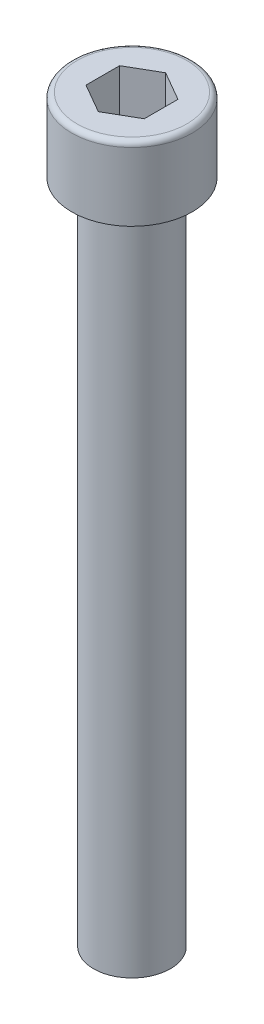
ISO-10303-21;
HEADER;
FILE_DESCRIPTION(('STEP AP214'),'2;1');
FILE_NAME('part.step','',(''),(''),'','','');
FILE_SCHEMA(('AUTOMOTIVE_DESIGN { 1 0 10303 214 1 1 1 1 }'));
ENDSEC;
DATA;
#1=APPLICATION_CONTEXT('core data for automotive mechanical design processes');
#2=APPLICATION_PROTOCOL_DEFINITION('international standard','automotive_design',2000,#1);
#3=PRODUCT_CONTEXT('',#1,'mechanical');
#4=PRODUCT('Part','Part','',(#3));
#5=PRODUCT_RELATED_PRODUCT_CATEGORY('part','',(#4));
#6=PRODUCT_DEFINITION_FORMATION('','',#4);
#7=PRODUCT_DEFINITION_CONTEXT('part definition',#1,'design');
#8=PRODUCT_DEFINITION('design','',#6,#7);
#9=PRODUCT_DEFINITION_SHAPE('','',#8);
#10=(LENGTH_UNIT() NAMED_UNIT(*) SI_UNIT(.MILLI.,.METRE.));
#11=(NAMED_UNIT(*) PLANE_ANGLE_UNIT() SI_UNIT($,.RADIAN.));
#12=(NAMED_UNIT(*) SI_UNIT($,.STERADIAN.) SOLID_ANGLE_UNIT());
#13=UNCERTAINTY_MEASURE_WITH_UNIT(LENGTH_MEASURE(1.E-05),#10,'distance_accuracy_value','');
#14=(GEOMETRIC_REPRESENTATION_CONTEXT(3) GLOBAL_UNCERTAINTY_ASSIGNED_CONTEXT((#13)) GLOBAL_UNIT_ASSIGNED_CONTEXT((#10,
#11,#12)) REPRESENTATION_CONTEXT('',''));
#15=CARTESIAN_POINT('',(0.,0.,0.));
#16=DIRECTION('',(0.,0.,1.));
#17=DIRECTION('',(1.,0.,0.));
#18=AXIS2_PLACEMENT_3D('',#15,#16,#17);
#19=CARTESIAN_POINT('',(0.,-31.75,0.));
#20=DIRECTION('',(0.,1.,0.));
#21=DIRECTION('',(0.,0.,1.));
#22=AXIS2_PLACEMENT_3D('',#19,#20,#21);
#23=CYLINDRICAL_SURFACE('',#22,1.8288);
#24=CARTESIAN_POINT('',(0.,-31.75,0.));
#25=DIRECTION('',(0.,1.,0.));
#26=DIRECTION('',(0.,0.,1.));
#27=AXIS2_PLACEMENT_3D('',#24,#25,#26);
#28=CIRCLE('',#27,1.8288);
#29=CARTESIAN_POINT('',(0.,-31.75,1.8288));
#30=VERTEX_POINT('',#29);
#31=EDGE_CURVE('E144',#30,#30,#28,.T.);
#32=ORIENTED_EDGE('',*,*,#31,.T.);
#33=EDGE_LOOP('',(#32));
#34=FACE_BOUND('',#33,.T.);
#35=CARTESIAN_POINT('',(0.,0.,0.));
#36=DIRECTION('',(0.,1.,0.));
#37=DIRECTION('',(0.,0.,1.));
#38=AXIS2_PLACEMENT_3D('',#35,#36,#37);
#39=CIRCLE('',#38,1.8288);
#40=CARTESIAN_POINT('',(0.,0.,1.8288));
#41=VERTEX_POINT('',#40);
#42=EDGE_CURVE('E143',#41,#41,#39,.T.);
#43=ORIENTED_EDGE('',*,*,#42,.F.);
#44=EDGE_LOOP('',(#43));
#45=FACE_BOUND('',#44,.T.);
#46=ADVANCED_FACE('F33',(#34,#45),#23,.T.);
#47=CARTESIAN_POINT('',(0.,-31.75,0.));
#48=DIRECTION('',(0.,1.,0.));
#49=DIRECTION('',(0.,0.,1.));
#50=AXIS2_PLACEMENT_3D('',#47,#48,#49);
#51=PLANE('',#50);
#52=ORIENTED_EDGE('',*,*,#31,.F.);
#53=EDGE_LOOP('',(#52));
#54=FACE_BOUND('',#53,.T.);
#55=ADVANCED_FACE('F167',(#54),#51,.F.);
#56=CARTESIAN_POINT('',(0.,3.5052,0.));
#57=DIRECTION('',(0.,-1.,0.));
#58=DIRECTION('',(0.,0.,-1.));
#59=AXIS2_PLACEMENT_3D('',#56,#57,#58);
#60=CYLINDRICAL_SURFACE('',#59,2.8702);
#61=CARTESIAN_POINT('',(0.,3.2512,0.));
#62=DIRECTION('',(0.,1.,0.));
#63=DIRECTION('',(0.,0.,1.));
#64=AXIS2_PLACEMENT_3D('',#61,#62,#63);
#65=CIRCLE('',#64,2.8702);
#66=CARTESIAN_POINT('',(0.,3.2512,2.8702));
#67=VERTEX_POINT('',#66);
#68=EDGE_CURVE('E11',#67,#67,#65,.F.);
#69=ORIENTED_EDGE('',*,*,#68,.T.);
#70=EDGE_LOOP('',(#69));
#71=FACE_BOUND('',#70,.T.);
#72=CARTESIAN_POINT('',(0.,0.,0.));
#73=DIRECTION('',(0.,1.,0.));
#74=DIRECTION('',(0.,0.,1.));
#75=AXIS2_PLACEMENT_3D('',#72,#73,#74);
#76=CIRCLE('',#75,2.8702);
#77=CARTESIAN_POINT('',(0.,0.,2.8702));
#78=VERTEX_POINT('',#77);
#79=EDGE_CURVE('E135',#78,#78,#76,.T.);
#80=ORIENTED_EDGE('',*,*,#79,.T.);
#81=EDGE_LOOP('',(#80));
#82=FACE_BOUND('',#81,.T.);
#83=ADVANCED_FACE('F172',(#71,#82),#60,.T.);
#84=CARTESIAN_POINT('',(0.,3.5052,0.));
#85=DIRECTION('',(0.,1.,0.));
#86=DIRECTION('',(0.,0.,1.));
#87=AXIS2_PLACEMENT_3D('',#84,#85,#86);
#88=PLANE('',#87);
#89=DIRECTION('',(-0.866025403784439,0.,-0.5));
#90=VECTOR('',#89,1.);
#91=CARTESIAN_POINT('',(1.3890625,3.5052,-0.801975608296215));
#92=LINE('',#91,#90);
#93=CARTESIAN_POINT('',(1.3890625,3.5052,-0.801975608296215));
#94=VERTEX_POINT('',#93);
#95=CARTESIAN_POINT('',(0.,3.5052,-1.60395121659243));
#96=VERTEX_POINT('',#95);
#97=EDGE_CURVE('E48',#94,#96,#92,.T.);
#98=ORIENTED_EDGE('',*,*,#97,.F.);
#99=DIRECTION('',(0.,0.,-1.));
#100=VECTOR('',#99,1.);
#101=CARTESIAN_POINT('',(1.3890625,3.5052,0.801975608296215));
#102=LINE('',#101,#100);
#103=CARTESIAN_POINT('',(1.3890625,3.5052,0.801975608296215));
#104=VERTEX_POINT('',#103);
#105=EDGE_CURVE('E131',#104,#94,#102,.T.);
#106=ORIENTED_EDGE('',*,*,#105,.F.);
#107=DIRECTION('',(0.866025403784439,0.,-0.5));
#108=VECTOR('',#107,1.);
#109=CARTESIAN_POINT('',(0.,3.5052,1.60395121659243));
#110=LINE('',#109,#108);
#111=CARTESIAN_POINT('',(0.,3.5052,1.60395121659243));
#112=VERTEX_POINT('',#111);
#113=EDGE_CURVE('E129',#112,#104,#110,.T.);
#114=ORIENTED_EDGE('',*,*,#113,.F.);
#115=DIRECTION('',(0.866025403784439,0.,0.5));
#116=VECTOR('',#115,1.);
#117=CARTESIAN_POINT('',(-1.3890625,3.5052,0.801975608296215));
#118=LINE('',#117,#116);
#119=CARTESIAN_POINT('',(-1.3890625,3.5052,0.801975608296215));
#120=VERTEX_POINT('',#119);
#121=EDGE_CURVE('E96',#120,#112,#118,.T.);
#122=ORIENTED_EDGE('',*,*,#121,.F.);
#123=DIRECTION('',(0.,0.,1.));
#124=VECTOR('',#123,1.);
#125=CARTESIAN_POINT('',(-1.3890625,3.5052,-0.801975608296215));
#126=LINE('',#125,#124);
#127=CARTESIAN_POINT('',(-1.3890625,3.5052,-0.801975608296215));
#128=VERTEX_POINT('',#127);
#129=EDGE_CURVE('E125',#128,#120,#126,.T.);
#130=ORIENTED_EDGE('',*,*,#129,.F.);
#131=DIRECTION('',(-0.866025403784439,0.,0.5));
#132=VECTOR('',#131,1.);
#133=CARTESIAN_POINT('',(0.,3.5052,-1.60395121659243));
#134=LINE('',#133,#132);
#135=EDGE_CURVE('E122',#96,#128,#134,.T.);
#136=ORIENTED_EDGE('',*,*,#135,.F.);
#137=EDGE_LOOP('',(#98,#106,#114,#122,#130,#136));
#138=FACE_BOUND('',#137,.T.);
#139=CARTESIAN_POINT('',(0.,3.5052,0.));
#140=DIRECTION('',(0.,1.,0.));
#141=DIRECTION('',(0.,0.,1.));
#142=AXIS2_PLACEMENT_3D('',#139,#140,#141);
#143=CIRCLE('',#142,2.6162);
#144=CARTESIAN_POINT('',(0.,3.5052,2.6162));
#145=VERTEX_POINT('',#144);
#146=EDGE_CURVE('E41',#145,#145,#143,.T.);
#147=ORIENTED_EDGE('',*,*,#146,.T.);
#148=EDGE_LOOP('',(#147));
#149=FACE_BOUND('',#148,.T.);
#150=ADVANCED_FACE('F151',(#138,#149),#88,.T.);
#151=CARTESIAN_POINT('',(0.,0.,0.));
#152=DIRECTION('',(0.,1.,0.));
#153=DIRECTION('',(0.,0.,1.));
#154=AXIS2_PLACEMENT_3D('',#151,#152,#153);
#155=PLANE('',#154);
#156=ORIENTED_EDGE('',*,*,#42,.T.);
#157=EDGE_LOOP('',(#156));
#158=FACE_BOUND('',#157,.T.);
#159=ORIENTED_EDGE('',*,*,#79,.F.);
#160=EDGE_LOOP('',(#159));
#161=FACE_BOUND('',#160,.T.);
#162=ADVANCED_FACE('F155',(#158,#161),#155,.F.);
#163=CARTESIAN_POINT('',(0.,3.2512,0.));
#164=DIRECTION('',(0.,1.,0.));
#165=DIRECTION('',(0.,0.,1.));
#166=AXIS2_PLACEMENT_3D('',#163,#164,#165);
#167=TOROIDAL_SURFACE('',#166,2.6162,0.254);
#168=ORIENTED_EDGE('',*,*,#68,.F.);
#169=EDGE_LOOP('',(#168));
#170=FACE_BOUND('',#169,.T.);
#171=ORIENTED_EDGE('',*,*,#146,.F.);
#172=EDGE_LOOP('',(#171));
#173=FACE_BOUND('',#172,.T.);
#174=ADVANCED_FACE('F35',(#170,#173),#167,.T.);
#175=CARTESIAN_POINT('',(1.3890625,0.9652,-0.801975608296215));
#176=DIRECTION('',(0.5,0.,-0.866025403784439));
#177=DIRECTION('',(-0.866025403784439,0.,-0.5));
#178=AXIS2_PLACEMENT_3D('',#175,#176,#177);
#179=PLANE('',#178);
#180=ORIENTED_EDGE('',*,*,#97,.T.);
#181=DIRECTION('',(0.,1.,0.));
#182=VECTOR('',#181,1.);
#183=CARTESIAN_POINT('',(0.,0.9652,-1.60395121659243));
#184=LINE('',#183,#182);
#185=CARTESIAN_POINT('',(0.,0.9652,-1.60395121659243));
#186=VERTEX_POINT('',#185);
#187=EDGE_CURVE('E78',#186,#96,#184,.T.);
#188=ORIENTED_EDGE('',*,*,#187,.F.);
#189=DIRECTION('',(-0.866025403784439,0.,-0.5));
#190=VECTOR('',#189,1.);
#191=CARTESIAN_POINT('',(1.3890625,0.9652,-0.801975608296215));
#192=LINE('',#191,#190);
#193=CARTESIAN_POINT('',(1.3890625,0.9652,-0.801975608296215));
#194=VERTEX_POINT('',#193);
#195=EDGE_CURVE('E133',#194,#186,#192,.T.);
#196=ORIENTED_EDGE('',*,*,#195,.F.);
#197=DIRECTION('',(0.,1.,0.));
#198=VECTOR('',#197,1.);
#199=CARTESIAN_POINT('',(1.3890625,0.9652,-0.801975608296215));
#200=LINE('',#199,#198);
#201=EDGE_CURVE('E56',#194,#94,#200,.T.);
#202=ORIENTED_EDGE('',*,*,#201,.T.);
#203=EDGE_LOOP('',(#180,#188,#196,#202));
#204=FACE_BOUND('',#203,.T.);
#205=ADVANCED_FACE('F154',(#204),#179,.F.);
#206=CARTESIAN_POINT('',(1.3890625,0.9652,0.801975608296215));
#207=DIRECTION('',(1.,0.,0.));
#208=DIRECTION('',(0.,0.,-1.));
#209=AXIS2_PLACEMENT_3D('',#206,#207,#208);
#210=PLANE('',#209);
#211=ORIENTED_EDGE('',*,*,#105,.T.);
#212=ORIENTED_EDGE('',*,*,#201,.F.);
#213=DIRECTION('',(0.,0.,-1.));
#214=VECTOR('',#213,1.);
#215=CARTESIAN_POINT('',(1.3890625,0.9652,0.801975608296215));
#216=LINE('',#215,#214);
#217=CARTESIAN_POINT('',(1.3890625,0.9652,0.801975608296215));
#218=VERTEX_POINT('',#217);
#219=EDGE_CURVE('E108',#218,#194,#216,.T.);
#220=ORIENTED_EDGE('',*,*,#219,.F.);
#221=DIRECTION('',(0.,1.,0.));
#222=VECTOR('',#221,1.);
#223=CARTESIAN_POINT('',(1.3890625,0.9652,0.801975608296215));
#224=LINE('',#223,#222);
#225=EDGE_CURVE('E100',#218,#104,#224,.T.);
#226=ORIENTED_EDGE('',*,*,#225,.T.);
#227=EDGE_LOOP('',(#211,#212,#220,#226));
#228=FACE_BOUND('',#227,.T.);
#229=ADVANCED_FACE('F161',(#228),#210,.F.);
#230=CARTESIAN_POINT('',(0.,0.9652,1.60395121659243));
#231=DIRECTION('',(0.5,0.,0.866025403784439));
#232=DIRECTION('',(0.866025403784439,0.,-0.5));
#233=AXIS2_PLACEMENT_3D('',#230,#231,#232);
#234=PLANE('',#233);
#235=ORIENTED_EDGE('',*,*,#113,.T.);
#236=ORIENTED_EDGE('',*,*,#225,.F.);
#237=DIRECTION('',(0.866025403784439,0.,-0.5));
#238=VECTOR('',#237,1.);
#239=CARTESIAN_POINT('',(0.,0.9652,1.60395121659243));
#240=LINE('',#239,#238);
#241=CARTESIAN_POINT('',(0.,0.9652,1.60395121659243));
#242=VERTEX_POINT('',#241);
#243=EDGE_CURVE('E104',#242,#218,#240,.T.);
#244=ORIENTED_EDGE('',*,*,#243,.F.);
#245=DIRECTION('',(0.,1.,0.));
#246=VECTOR('',#245,1.);
#247=CARTESIAN_POINT('',(0.,0.9652,1.60395121659243));
#248=LINE('',#247,#246);
#249=EDGE_CURVE('E89',#242,#112,#248,.T.);
#250=ORIENTED_EDGE('',*,*,#249,.T.);
#251=EDGE_LOOP('',(#235,#236,#244,#250));
#252=FACE_BOUND('',#251,.T.);
#253=ADVANCED_FACE('F105',(#252),#234,.F.);
#254=CARTESIAN_POINT('',(-1.3890625,0.9652,0.801975608296215));
#255=DIRECTION('',(-0.5,0.,0.866025403784439));
#256=DIRECTION('',(0.866025403784439,0.,0.5));
#257=AXIS2_PLACEMENT_3D('',#254,#255,#256);
#258=PLANE('',#257);
#259=ORIENTED_EDGE('',*,*,#121,.T.);
#260=ORIENTED_EDGE('',*,*,#249,.F.);
#261=DIRECTION('',(0.866025403784439,0.,0.5));
#262=VECTOR('',#261,1.);
#263=CARTESIAN_POINT('',(-1.3890625,0.9652,0.801975608296215));
#264=LINE('',#263,#262);
#265=CARTESIAN_POINT('',(-1.3890625,0.9652,0.801975608296215));
#266=VERTEX_POINT('',#265);
#267=EDGE_CURVE('E93',#266,#242,#264,.T.);
#268=ORIENTED_EDGE('',*,*,#267,.F.);
#269=DIRECTION('',(0.,1.,0.));
#270=VECTOR('',#269,1.);
#271=CARTESIAN_POINT('',(-1.3890625,0.9652,0.801975608296215));
#272=LINE('',#271,#270);
#273=EDGE_CURVE('E101',#266,#120,#272,.T.);
#274=ORIENTED_EDGE('',*,*,#273,.T.);
#275=EDGE_LOOP('',(#259,#260,#268,#274));
#276=FACE_BOUND('',#275,.T.);
#277=ADVANCED_FACE('F91',(#276),#258,.F.);
#278=CARTESIAN_POINT('',(-1.3890625,0.9652,-0.801975608296215));
#279=DIRECTION('',(-1.,0.,0.));
#280=DIRECTION('',(0.,0.,1.));
#281=AXIS2_PLACEMENT_3D('',#278,#279,#280);
#282=PLANE('',#281);
#283=ORIENTED_EDGE('',*,*,#129,.T.);
#284=ORIENTED_EDGE('',*,*,#273,.F.);
#285=DIRECTION('',(0.,0.,1.));
#286=VECTOR('',#285,1.);
#287=CARTESIAN_POINT('',(-1.3890625,0.9652,-0.801975608296215));
#288=LINE('',#287,#286);
#289=CARTESIAN_POINT('',(-1.3890625,0.9652,-0.801975608296215));
#290=VERTEX_POINT('',#289);
#291=EDGE_CURVE('E114',#290,#266,#288,.T.);
#292=ORIENTED_EDGE('',*,*,#291,.F.);
#293=DIRECTION('',(0.,1.,0.));
#294=VECTOR('',#293,1.);
#295=CARTESIAN_POINT('',(-1.3890625,0.9652,-0.801975608296215));
#296=LINE('',#295,#294);
#297=EDGE_CURVE('E138',#290,#128,#296,.T.);
#298=ORIENTED_EDGE('',*,*,#297,.T.);
#299=EDGE_LOOP('',(#283,#284,#292,#298));
#300=FACE_BOUND('',#299,.T.);
#301=ADVANCED_FACE('F186',(#300),#282,.F.);
#302=CARTESIAN_POINT('',(0.,0.9652,-1.60395121659243));
#303=DIRECTION('',(-0.5,0.,-0.866025403784439));
#304=DIRECTION('',(-0.866025403784439,0.,0.5));
#305=AXIS2_PLACEMENT_3D('',#302,#303,#304);
#306=PLANE('',#305);
#307=ORIENTED_EDGE('',*,*,#135,.T.);
#308=ORIENTED_EDGE('',*,*,#297,.F.);
#309=DIRECTION('',(-0.866025403784439,0.,0.5));
#310=VECTOR('',#309,1.);
#311=CARTESIAN_POINT('',(0.,0.9652,-1.60395121659243));
#312=LINE('',#311,#310);
#313=EDGE_CURVE('E116',#186,#290,#312,.T.);
#314=ORIENTED_EDGE('',*,*,#313,.F.);
#315=ORIENTED_EDGE('',*,*,#187,.T.);
#316=EDGE_LOOP('',(#307,#308,#314,#315));
#317=FACE_BOUND('',#316,.T.);
#318=ADVANCED_FACE('F183',(#317),#306,.F.);
#319=CARTESIAN_POINT('',(0.,0.9652,0.));
#320=DIRECTION('',(0.,1.,0.));
#321=DIRECTION('',(0.,0.,1.));
#322=AXIS2_PLACEMENT_3D('',#319,#320,#321);
#323=PLANE('',#322);
#324=ORIENTED_EDGE('',*,*,#195,.T.);
#325=ORIENTED_EDGE('',*,*,#313,.T.);
#326=ORIENTED_EDGE('',*,*,#291,.T.);
#327=ORIENTED_EDGE('',*,*,#267,.T.);
#328=ORIENTED_EDGE('',*,*,#243,.T.);
#329=ORIENTED_EDGE('',*,*,#219,.T.);
#330=EDGE_LOOP('',(#324,#325,#326,#327,#328,#329));
#331=FACE_BOUND('',#330,.T.);
#332=ADVANCED_FACE('F111',(#331),#323,.T.);
#333=CLOSED_SHELL('',(#46,#55,#83,#150,#162,#174,#205,#229,#253,#277,#301,#318,#332));
#334=MANIFOLD_SOLID_BREP('B2',#333);
#335=ADVANCED_BREP_SHAPE_REPRESENTATION('',(#18,#334),#14);
#336=SHAPE_DEFINITION_REPRESENTATION(#9,#335);
ENDSEC;
END-ISO-10303-21;
